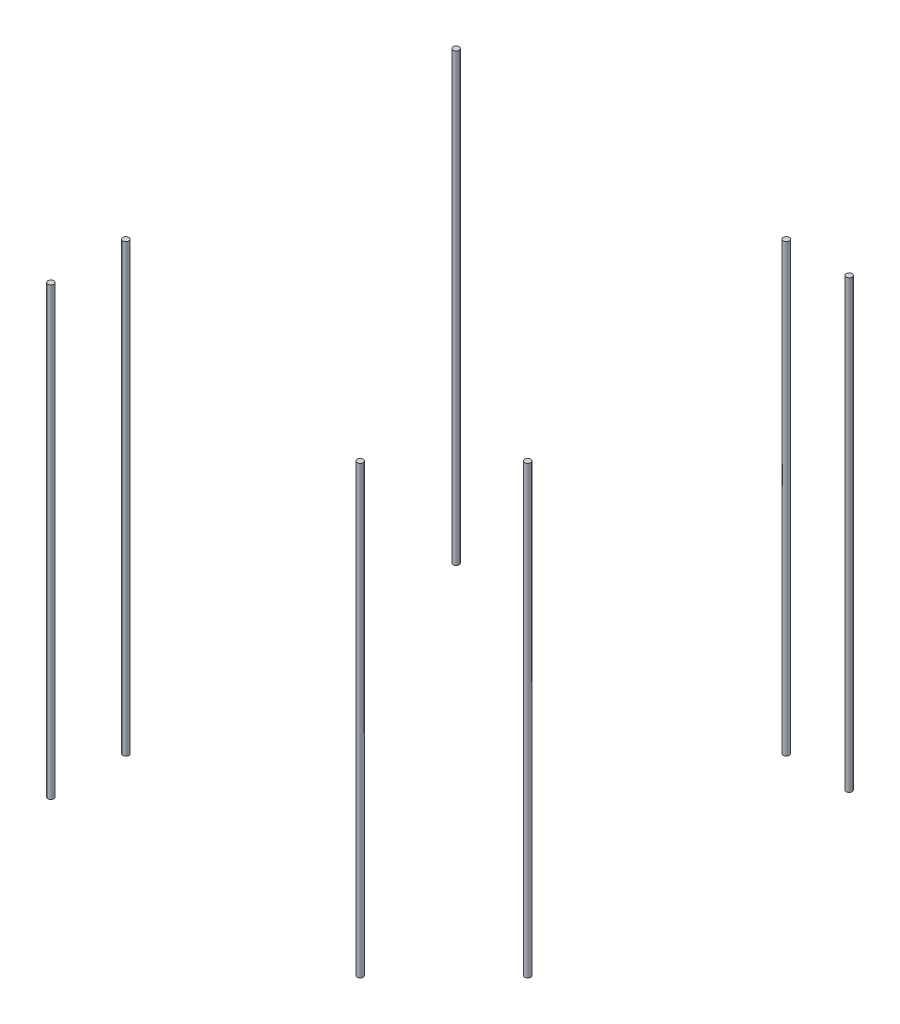
ISO-10303-21;
HEADER;
FILE_DESCRIPTION(('STEP AP214'),'2;1');
FILE_NAME('part.step','',(''),(''),'','','');
FILE_SCHEMA(('AUTOMOTIVE_DESIGN { 1 0 10303 214 1 1 1 1 }'));
ENDSEC;
DATA;
#1=APPLICATION_CONTEXT('core data for automotive mechanical design processes');
#2=APPLICATION_PROTOCOL_DEFINITION('international standard','automotive_design',2000,#1);
#3=PRODUCT_CONTEXT('',#1,'mechanical');
#4=PRODUCT('Part','Part','',(#3));
#5=PRODUCT_RELATED_PRODUCT_CATEGORY('part','',(#4));
#6=PRODUCT_DEFINITION_FORMATION('','',#4);
#7=PRODUCT_DEFINITION_CONTEXT('part definition',#1,'design');
#8=PRODUCT_DEFINITION('design','',#6,#7);
#9=PRODUCT_DEFINITION_SHAPE('','',#8);
#10=(LENGTH_UNIT() NAMED_UNIT(*) SI_UNIT(.MILLI.,.METRE.));
#11=(NAMED_UNIT(*) PLANE_ANGLE_UNIT() SI_UNIT($,.RADIAN.));
#12=(NAMED_UNIT(*) SI_UNIT($,.STERADIAN.) SOLID_ANGLE_UNIT());
#13=UNCERTAINTY_MEASURE_WITH_UNIT(LENGTH_MEASURE(1.E-05),#10,'distance_accuracy_value','');
#14=(GEOMETRIC_REPRESENTATION_CONTEXT(3) GLOBAL_UNCERTAINTY_ASSIGNED_CONTEXT((#13)) GLOBAL_UNIT_ASSIGNED_CONTEXT((#10,
#11,#12)) REPRESENTATION_CONTEXT('',''));
#15=CARTESIAN_POINT('',(0.,0.,0.));
#16=DIRECTION('',(0.,0.,1.));
#17=DIRECTION('',(1.,0.,0.));
#18=AXIS2_PLACEMENT_3D('',#15,#16,#17);
#19=CARTESIAN_POINT('',(397.000000000002,-419.999999999998,9.00000000000034));
#20=DIRECTION('',(0.,1.,0.));
#21=DIRECTION('',(0.,0.,1.));
#22=AXIS2_PLACEMENT_3D('',#19,#20,#21);
#23=CYLINDRICAL_SURFACE('',#22,2.99999999999999);
#24=CARTESIAN_POINT('',(397.000000000002,-419.999999999998,9.00000000000034));
#25=DIRECTION('',(0.,1.,0.));
#26=DIRECTION('',(0.,0.,1.));
#27=AXIS2_PLACEMENT_3D('',#24,#25,#26);
#28=CIRCLE('',#27,2.99999999999999);
#29=CARTESIAN_POINT('',(397.000000000002,-419.999999999998,12.0000000000003));
#30=VERTEX_POINT('',#29);
#31=EDGE_CURVE('E11',#30,#30,#28,.T.);
#32=ORIENTED_EDGE('',*,*,#31,.T.);
#33=EDGE_LOOP('',(#32));
#34=FACE_BOUND('',#33,.T.);
#35=CARTESIAN_POINT('',(397.000000000002,20.0000000000022,9.00000000000034));
#36=DIRECTION('',(0.,1.,0.));
#37=DIRECTION('',(0.,0.,1.));
#38=AXIS2_PLACEMENT_3D('',#35,#36,#37);
#39=CIRCLE('',#38,2.99999999999999);
#40=CARTESIAN_POINT('',(397.000000000002,20.0000000000022,12.0000000000003));
#41=VERTEX_POINT('',#40);
#42=EDGE_CURVE('E48',#41,#41,#39,.T.);
#43=ORIENTED_EDGE('',*,*,#42,.F.);
#44=EDGE_LOOP('',(#43));
#45=FACE_BOUND('',#44,.T.);
#46=ADVANCED_FACE('F41',(#34,#45),#23,.T.);
#47=CARTESIAN_POINT('',(397.000000000002,-419.999999999998,9.00000000000034));
#48=DIRECTION('',(0.,1.,0.));
#49=DIRECTION('',(0.,0.,1.));
#50=AXIS2_PLACEMENT_3D('',#47,#48,#49);
#51=PLANE('',#50);
#52=ORIENTED_EDGE('',*,*,#31,.F.);
#53=EDGE_LOOP('',(#52));
#54=FACE_BOUND('',#53,.T.);
#55=ADVANCED_FACE('F60',(#54),#51,.F.);
#56=CARTESIAN_POINT('',(397.000000000002,20.0000000000022,9.00000000000034));
#57=DIRECTION('',(0.,1.,0.));
#58=DIRECTION('',(0.,0.,1.));
#59=AXIS2_PLACEMENT_3D('',#56,#57,#58);
#60=PLANE('',#59);
#61=ORIENTED_EDGE('',*,*,#42,.T.);
#62=EDGE_LOOP('',(#61));
#63=FACE_BOUND('',#62,.T.);
#64=ADVANCED_FACE('F57',(#63),#60,.T.);
#65=CLOSED_SHELL('',(#46,#55,#64));
#66=MANIFOLD_SOLID_BREP('B2',#65);
#67=CARTESIAN_POINT('',(8.99999999999945,-420.,408.999999999999));
#68=DIRECTION('',(0.,1.,0.));
#69=DIRECTION('',(0.,0.,1.));
#70=AXIS2_PLACEMENT_3D('',#67,#68,#69);
#71=CYLINDRICAL_SURFACE('',#70,3.);
#72=CARTESIAN_POINT('',(8.99999999999945,-420.,408.999999999999));
#73=DIRECTION('',(0.,1.,0.));
#74=DIRECTION('',(0.,0.,1.));
#75=AXIS2_PLACEMENT_3D('',#72,#73,#74);
#76=CIRCLE('',#75,3.);
#77=CARTESIAN_POINT('',(8.99999999999945,-420.,411.999999999999));
#78=VERTEX_POINT('',#77);
#79=EDGE_CURVE('E40',#78,#78,#76,.T.);
#80=ORIENTED_EDGE('',*,*,#79,.T.);
#81=EDGE_LOOP('',(#80));
#82=FACE_BOUND('',#81,.T.);
#83=CARTESIAN_POINT('',(8.99999999999945,20.,408.999999999999));
#84=DIRECTION('',(0.,1.,0.));
#85=DIRECTION('',(0.,0.,1.));
#86=AXIS2_PLACEMENT_3D('',#83,#84,#85);
#87=CIRCLE('',#86,3.);
#88=CARTESIAN_POINT('',(8.99999999999945,20.,411.999999999999));
#89=VERTEX_POINT('',#88);
#90=EDGE_CURVE('E100',#89,#89,#87,.T.);
#91=ORIENTED_EDGE('',*,*,#90,.F.);
#92=EDGE_LOOP('',(#91));
#93=FACE_BOUND('',#92,.T.);
#94=ADVANCED_FACE('F93',(#82,#93),#71,.T.);
#95=CARTESIAN_POINT('',(8.99999999999945,-420.,408.999999999999));
#96=DIRECTION('',(0.,1.,0.));
#97=DIRECTION('',(0.,0.,1.));
#98=AXIS2_PLACEMENT_3D('',#95,#96,#97);
#99=PLANE('',#98);
#100=ORIENTED_EDGE('',*,*,#79,.F.);
#101=EDGE_LOOP('',(#100));
#102=FACE_BOUND('',#101,.T.);
#103=ADVANCED_FACE('F112',(#102),#99,.F.);
#104=CARTESIAN_POINT('',(8.99999999999945,20.,408.999999999999));
#105=DIRECTION('',(0.,1.,0.));
#106=DIRECTION('',(0.,0.,1.));
#107=AXIS2_PLACEMENT_3D('',#104,#105,#106);
#108=PLANE('',#107);
#109=ORIENTED_EDGE('',*,*,#90,.T.);
#110=EDGE_LOOP('',(#109));
#111=FACE_BOUND('',#110,.T.);
#112=ADVANCED_FACE('F109',(#111),#108,.T.);
#113=CLOSED_SHELL('',(#94,#103,#112));
#114=MANIFOLD_SOLID_BREP('B6',#113);
#115=CARTESIAN_POINT('',(397.000000000002,-419.999999999998,326.289321881344));
#116=DIRECTION('',(0.,1.,0.));
#117=DIRECTION('',(0.,0.,1.));
#118=AXIS2_PLACEMENT_3D('',#115,#116,#117);
#119=CYLINDRICAL_SURFACE('',#118,2.99999999999999);
#120=CARTESIAN_POINT('',(397.000000000002,-419.999999999998,326.289321881344));
#121=DIRECTION('',(0.,1.,0.));
#122=DIRECTION('',(0.,0.,1.));
#123=AXIS2_PLACEMENT_3D('',#120,#121,#122);
#124=CIRCLE('',#123,2.99999999999999);
#125=CARTESIAN_POINT('',(397.000000000002,-419.999999999998,329.289321881344));
#126=VERTEX_POINT('',#125);
#127=EDGE_CURVE('E92',#126,#126,#124,.T.);
#128=ORIENTED_EDGE('',*,*,#127,.T.);
#129=EDGE_LOOP('',(#128));
#130=FACE_BOUND('',#129,.T.);
#131=CARTESIAN_POINT('',(397.000000000002,20.0000000000022,326.289321881344));
#132=DIRECTION('',(0.,1.,0.));
#133=DIRECTION('',(0.,0.,1.));
#134=AXIS2_PLACEMENT_3D('',#131,#132,#133);
#135=CIRCLE('',#134,2.99999999999999);
#136=CARTESIAN_POINT('',(397.000000000002,20.0000000000022,329.289321881344));
#137=VERTEX_POINT('',#136);
#138=EDGE_CURVE('E152',#137,#137,#135,.T.);
#139=ORIENTED_EDGE('',*,*,#138,.F.);
#140=EDGE_LOOP('',(#139));
#141=FACE_BOUND('',#140,.T.);
#142=ADVANCED_FACE('F145',(#130,#141),#119,.T.);
#143=CARTESIAN_POINT('',(397.000000000002,-419.999999999998,326.289321881344));
#144=DIRECTION('',(0.,1.,0.));
#145=DIRECTION('',(0.,0.,1.));
#146=AXIS2_PLACEMENT_3D('',#143,#144,#145);
#147=PLANE('',#146);
#148=ORIENTED_EDGE('',*,*,#127,.F.);
#149=EDGE_LOOP('',(#148));
#150=FACE_BOUND('',#149,.T.);
#151=ADVANCED_FACE('F164',(#150),#147,.F.);
#152=CARTESIAN_POINT('',(397.000000000002,20.0000000000022,326.289321881344));
#153=DIRECTION('',(0.,1.,0.));
#154=DIRECTION('',(0.,0.,1.));
#155=AXIS2_PLACEMENT_3D('',#152,#153,#154);
#156=PLANE('',#155);
#157=ORIENTED_EDGE('',*,*,#138,.T.);
#158=EDGE_LOOP('',(#157));
#159=FACE_BOUND('',#158,.T.);
#160=ADVANCED_FACE('F161',(#159),#156,.T.);
#161=CLOSED_SHELL('',(#142,#151,#160));
#162=MANIFOLD_SOLID_BREP('B35',#161);
#163=CARTESIAN_POINT('',(314.289321881341,-420.,409.));
#164=DIRECTION('',(0.,1.,0.));
#165=DIRECTION('',(0.,0.,1.));
#166=AXIS2_PLACEMENT_3D('',#163,#164,#165);
#167=CYLINDRICAL_SURFACE('',#166,2.99999999999999);
#168=CARTESIAN_POINT('',(314.289321881341,-420.,409.));
#169=DIRECTION('',(0.,1.,0.));
#170=DIRECTION('',(0.,0.,1.));
#171=AXIS2_PLACEMENT_3D('',#168,#169,#170);
#172=CIRCLE('',#171,2.99999999999999);
#173=CARTESIAN_POINT('',(314.289321881341,-420.,412.));
#174=VERTEX_POINT('',#173);
#175=EDGE_CURVE('E144',#174,#174,#172,.T.);
#176=ORIENTED_EDGE('',*,*,#175,.T.);
#177=EDGE_LOOP('',(#176));
#178=FACE_BOUND('',#177,.T.);
#179=CARTESIAN_POINT('',(314.289321881341,20.,409.));
#180=DIRECTION('',(0.,1.,0.));
#181=DIRECTION('',(0.,0.,1.));
#182=AXIS2_PLACEMENT_3D('',#179,#180,#181);
#183=CIRCLE('',#182,2.99999999999999);
#184=CARTESIAN_POINT('',(314.289321881341,20.,412.));
#185=VERTEX_POINT('',#184);
#186=EDGE_CURVE('E204',#185,#185,#183,.T.);
#187=ORIENTED_EDGE('',*,*,#186,.F.);
#188=EDGE_LOOP('',(#187));
#189=FACE_BOUND('',#188,.T.);
#190=ADVANCED_FACE('F197',(#178,#189),#167,.T.);
#191=CARTESIAN_POINT('',(314.289321881341,-420.,409.));
#192=DIRECTION('',(0.,1.,0.));
#193=DIRECTION('',(0.,0.,1.));
#194=AXIS2_PLACEMENT_3D('',#191,#192,#193);
#195=PLANE('',#194);
#196=ORIENTED_EDGE('',*,*,#175,.F.);
#197=EDGE_LOOP('',(#196));
#198=FACE_BOUND('',#197,.T.);
#199=ADVANCED_FACE('F216',(#198),#195,.F.);
#200=CARTESIAN_POINT('',(314.289321881341,20.,409.));
#201=DIRECTION('',(0.,1.,0.));
#202=DIRECTION('',(0.,0.,1.));
#203=AXIS2_PLACEMENT_3D('',#200,#201,#202);
#204=PLANE('',#203);
#205=ORIENTED_EDGE('',*,*,#186,.T.);
#206=EDGE_LOOP('',(#205));
#207=FACE_BOUND('',#206,.T.);
#208=ADVANCED_FACE('F213',(#207),#204,.T.);
#209=CLOSED_SHELL('',(#190,#199,#208));
#210=MANIFOLD_SOLID_BREP('B87',#209);
#211=CARTESIAN_POINT('',(8.99999999999945,-420.,335.000000000001));
#212=DIRECTION('',(0.,1.,0.));
#213=DIRECTION('',(0.,0.,1.));
#214=AXIS2_PLACEMENT_3D('',#211,#212,#213);
#215=CYLINDRICAL_SURFACE('',#214,3.);
#216=CARTESIAN_POINT('',(8.99999999999945,-420.,335.000000000001));
#217=DIRECTION('',(0.,1.,0.));
#218=DIRECTION('',(0.,0.,1.));
#219=AXIS2_PLACEMENT_3D('',#216,#217,#218);
#220=CIRCLE('',#219,3.);
#221=CARTESIAN_POINT('',(8.99999999999945,-420.,338.000000000001));
#222=VERTEX_POINT('',#221);
#223=EDGE_CURVE('E196',#222,#222,#220,.T.);
#224=ORIENTED_EDGE('',*,*,#223,.T.);
#225=EDGE_LOOP('',(#224));
#226=FACE_BOUND('',#225,.T.);
#227=CARTESIAN_POINT('',(8.99999999999945,20.,335.000000000001));
#228=DIRECTION('',(0.,1.,0.));
#229=DIRECTION('',(0.,0.,1.));
#230=AXIS2_PLACEMENT_3D('',#227,#228,#229);
#231=CIRCLE('',#230,3.);
#232=CARTESIAN_POINT('',(8.99999999999945,20.,338.000000000001));
#233=VERTEX_POINT('',#232);
#234=EDGE_CURVE('E256',#233,#233,#231,.T.);
#235=ORIENTED_EDGE('',*,*,#234,.F.);
#236=EDGE_LOOP('',(#235));
#237=FACE_BOUND('',#236,.T.);
#238=ADVANCED_FACE('F249',(#226,#237),#215,.T.);
#239=CARTESIAN_POINT('',(8.99999999999945,-420.,335.000000000001));
#240=DIRECTION('',(0.,1.,0.));
#241=DIRECTION('',(0.,0.,1.));
#242=AXIS2_PLACEMENT_3D('',#239,#240,#241);
#243=PLANE('',#242);
#244=ORIENTED_EDGE('',*,*,#223,.F.);
#245=EDGE_LOOP('',(#244));
#246=FACE_BOUND('',#245,.T.);
#247=ADVANCED_FACE('F268',(#246),#243,.F.);
#248=CARTESIAN_POINT('',(8.99999999999945,20.,335.000000000001));
#249=DIRECTION('',(0.,1.,0.));
#250=DIRECTION('',(0.,0.,1.));
#251=AXIS2_PLACEMENT_3D('',#248,#249,#250);
#252=PLANE('',#251);
#253=ORIENTED_EDGE('',*,*,#234,.T.);
#254=EDGE_LOOP('',(#253));
#255=FACE_BOUND('',#254,.T.);
#256=ADVANCED_FACE('F265',(#255),#252,.T.);
#257=CLOSED_SHELL('',(#238,#247,#256));
#258=MANIFOLD_SOLID_BREP('B139',#257);
#259=CARTESIAN_POINT('',(9.00000000000034,-420.,9.00000000000034));
#260=DIRECTION('',(0.,1.,0.));
#261=DIRECTION('',(0.,0.,1.));
#262=AXIS2_PLACEMENT_3D('',#259,#260,#261);
#263=CYLINDRICAL_SURFACE('',#262,3.);
#264=CARTESIAN_POINT('',(9.00000000000034,-420.,9.00000000000034));
#265=DIRECTION('',(0.,1.,0.));
#266=DIRECTION('',(0.,0.,1.));
#267=AXIS2_PLACEMENT_3D('',#264,#265,#266);
#268=CIRCLE('',#267,3.);
#269=CARTESIAN_POINT('',(9.00000000000034,-420.,12.0000000000003));
#270=VERTEX_POINT('',#269);
#271=EDGE_CURVE('E248',#270,#270,#268,.T.);
#272=ORIENTED_EDGE('',*,*,#271,.T.);
#273=EDGE_LOOP('',(#272));
#274=FACE_BOUND('',#273,.T.);
#275=CARTESIAN_POINT('',(9.00000000000034,20.,9.00000000000034));
#276=DIRECTION('',(0.,1.,0.));
#277=DIRECTION('',(0.,0.,1.));
#278=AXIS2_PLACEMENT_3D('',#275,#276,#277);
#279=CIRCLE('',#278,3.);
#280=CARTESIAN_POINT('',(9.00000000000034,20.,12.0000000000003));
#281=VERTEX_POINT('',#280);
#282=EDGE_CURVE('E307',#281,#281,#279,.T.);
#283=ORIENTED_EDGE('',*,*,#282,.F.);
#284=EDGE_LOOP('',(#283));
#285=FACE_BOUND('',#284,.T.);
#286=ADVANCED_FACE('F300',(#274,#285),#263,.T.);
#287=CARTESIAN_POINT('',(9.00000000000034,-420.,9.00000000000034));
#288=DIRECTION('',(0.,1.,0.));
#289=DIRECTION('',(0.,0.,1.));
#290=AXIS2_PLACEMENT_3D('',#287,#288,#289);
#291=PLANE('',#290);
#292=ORIENTED_EDGE('',*,*,#271,.F.);
#293=EDGE_LOOP('',(#292));
#294=FACE_BOUND('',#293,.T.);
#295=ADVANCED_FACE('F319',(#294),#291,.F.);
#296=CARTESIAN_POINT('',(9.00000000000034,20.,9.00000000000034));
#297=DIRECTION('',(0.,1.,0.));
#298=DIRECTION('',(0.,0.,1.));
#299=AXIS2_PLACEMENT_3D('',#296,#297,#298);
#300=PLANE('',#299);
#301=ORIENTED_EDGE('',*,*,#282,.T.);
#302=EDGE_LOOP('',(#301));
#303=FACE_BOUND('',#302,.T.);
#304=ADVANCED_FACE('F316',(#303),#300,.T.);
#305=CLOSED_SHELL('',(#286,#295,#304));
#306=MANIFOLD_SOLID_BREP('B191',#305);
#307=CARTESIAN_POINT('',(335.,-419.999999999998,9.00000000000034));
#308=DIRECTION('',(0.,1.,0.));
#309=DIRECTION('',(0.,0.,1.));
#310=AXIS2_PLACEMENT_3D('',#307,#308,#309);
#311=CYLINDRICAL_SURFACE('',#310,2.99999999999999);
#312=CARTESIAN_POINT('',(335.,-419.999999999998,9.00000000000034));
#313=DIRECTION('',(0.,1.,0.));
#314=DIRECTION('',(0.,0.,1.));
#315=AXIS2_PLACEMENT_3D('',#312,#313,#314);
#316=CIRCLE('',#315,2.99999999999999);
#317=CARTESIAN_POINT('',(335.,-419.999999999998,12.0000000000003));
#318=VERTEX_POINT('',#317);
#319=EDGE_CURVE('E299',#318,#318,#316,.T.);
#320=ORIENTED_EDGE('',*,*,#319,.T.);
#321=EDGE_LOOP('',(#320));
#322=FACE_BOUND('',#321,.T.);
#323=CARTESIAN_POINT('',(335.,20.0000000000022,9.00000000000034));
#324=DIRECTION('',(0.,1.,0.));
#325=DIRECTION('',(0.,0.,1.));
#326=AXIS2_PLACEMENT_3D('',#323,#324,#325);
#327=CIRCLE('',#326,2.99999999999999);
#328=CARTESIAN_POINT('',(335.,20.0000000000022,12.0000000000003));
#329=VERTEX_POINT('',#328);
#330=EDGE_CURVE('E351',#329,#329,#327,.T.);
#331=ORIENTED_EDGE('',*,*,#330,.F.);
#332=EDGE_LOOP('',(#331));
#333=FACE_BOUND('',#332,.T.);
#334=ADVANCED_FACE('F344',(#322,#333),#311,.T.);
#335=CARTESIAN_POINT('',(335.,-419.999999999998,9.00000000000034));
#336=DIRECTION('',(0.,1.,0.));
#337=DIRECTION('',(0.,0.,1.));
#338=AXIS2_PLACEMENT_3D('',#335,#336,#337);
#339=PLANE('',#338);
#340=ORIENTED_EDGE('',*,*,#319,.F.);
#341=EDGE_LOOP('',(#340));
#342=FACE_BOUND('',#341,.T.);
#343=ADVANCED_FACE('F363',(#342),#339,.F.);
#344=CARTESIAN_POINT('',(335.,20.0000000000022,9.00000000000034));
#345=DIRECTION('',(0.,1.,0.));
#346=DIRECTION('',(0.,0.,1.));
#347=AXIS2_PLACEMENT_3D('',#344,#345,#346);
#348=PLANE('',#347);
#349=ORIENTED_EDGE('',*,*,#330,.T.);
#350=EDGE_LOOP('',(#349));
#351=FACE_BOUND('',#350,.T.);
#352=ADVANCED_FACE('F360',(#351),#348,.T.);
#353=CLOSED_SHELL('',(#334,#343,#352));
#354=MANIFOLD_SOLID_BREP('B243',#353);
#355=ADVANCED_BREP_SHAPE_REPRESENTATION('',(#18,#66,#114,#162,#210,#258,#306,#354),#14);
#356=SHAPE_DEFINITION_REPRESENTATION(#9,#355);
ENDSEC;
END-ISO-10303-21;
